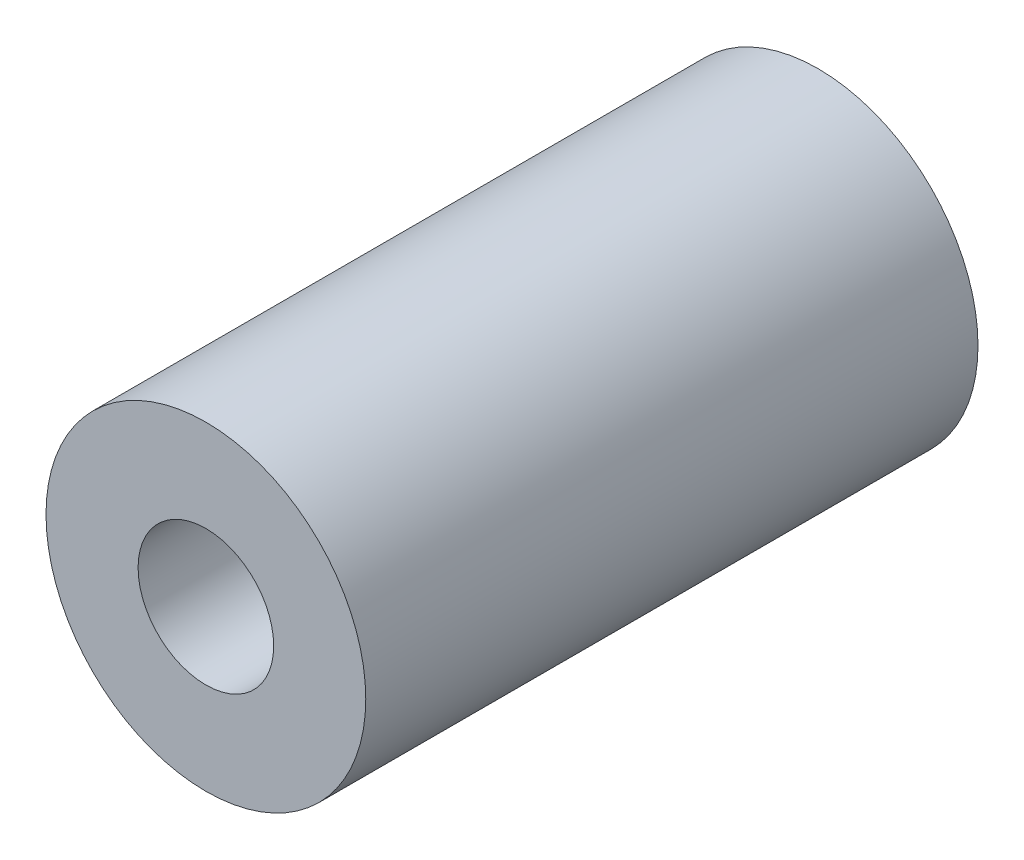
ISO-10303-21;
HEADER;
FILE_DESCRIPTION(('STEP AP214'),'2;1');
FILE_NAME('part.step','',(''),(''),'','','');
FILE_SCHEMA(('AUTOMOTIVE_DESIGN { 1 0 10303 214 1 1 1 1 }'));
ENDSEC;
DATA;
#1=APPLICATION_CONTEXT('core data for automotive mechanical design processes');
#2=APPLICATION_PROTOCOL_DEFINITION('international standard','automotive_design',2000,#1);
#3=PRODUCT_CONTEXT('',#1,'mechanical');
#4=PRODUCT('Part','Part','',(#3));
#5=PRODUCT_RELATED_PRODUCT_CATEGORY('part','',(#4));
#6=PRODUCT_DEFINITION_FORMATION('','',#4);
#7=PRODUCT_DEFINITION_CONTEXT('part definition',#1,'design');
#8=PRODUCT_DEFINITION('design','',#6,#7);
#9=PRODUCT_DEFINITION_SHAPE('','',#8);
#10=(LENGTH_UNIT() NAMED_UNIT(*) SI_UNIT(.MILLI.,.METRE.));
#11=(NAMED_UNIT(*) PLANE_ANGLE_UNIT() SI_UNIT($,.RADIAN.));
#12=(NAMED_UNIT(*) SI_UNIT($,.STERADIAN.) SOLID_ANGLE_UNIT());
#13=UNCERTAINTY_MEASURE_WITH_UNIT(LENGTH_MEASURE(1.E-05),#10,'distance_accuracy_value','');
#14=(GEOMETRIC_REPRESENTATION_CONTEXT(3) GLOBAL_UNCERTAINTY_ASSIGNED_CONTEXT((#13)) GLOBAL_UNIT_ASSIGNED_CONTEXT((#10,
#11,#12)) REPRESENTATION_CONTEXT('',''));
#15=CARTESIAN_POINT('',(0.,0.,0.));
#16=DIRECTION('',(0.,0.,1.));
#17=DIRECTION('',(1.,0.,0.));
#18=AXIS2_PLACEMENT_3D('',#15,#16,#17);
#19=CARTESIAN_POINT('',(0.,0.,9.1186));
#20=DIRECTION('',(0.,0.,-1.));
#21=DIRECTION('',(-1.,0.,0.));
#22=AXIS2_PLACEMENT_3D('',#19,#20,#21);
#23=CYLINDRICAL_SURFACE('',#22,4.7625);
#24=CARTESIAN_POINT('',(0.,0.,9.1186));
#25=DIRECTION('',(0.,0.,1.));
#26=DIRECTION('',(1.,0.,0.));
#27=AXIS2_PLACEMENT_3D('',#24,#25,#26);
#28=CIRCLE('',#27,4.7625);
#29=CARTESIAN_POINT('',(-4.7625,0.,9.1186));
#30=VERTEX_POINT('',#29);
#31=EDGE_CURVE('E10',#30,#30,#28,.T.);
#32=CARTESIAN_POINT('',(0.,0.,-9.1186));
#33=DIRECTION('',(0.,0.,1.));
#34=DIRECTION('',(1.,0.,0.));
#35=AXIS2_PLACEMENT_3D('',#32,#33,#34);
#36=CIRCLE('',#35,4.7625);
#37=CARTESIAN_POINT('',(-4.7625,0.,-9.1186));
#38=VERTEX_POINT('',#37);
#39=EDGE_CURVE('E43',#38,#38,#36,.T.);
#40=CARTESIAN_POINT('',(-4.7625,0.,9.1186));
#41=CARTESIAN_POINT('',(-4.7625,0.,8.92862916666667));
#42=CARTESIAN_POINT('',(-4.7625,0.,8.73865833333333));
#43=CARTESIAN_POINT('',(-4.7625,0.,8.35871666666666));
#44=CARTESIAN_POINT('',(-4.7625,0.,8.16874583333333));
#45=CARTESIAN_POINT('',(-4.7625,0.,7.78880416666667));
#46=CARTESIAN_POINT('',(-4.7625,0.,7.59883333333333));
#47=CARTESIAN_POINT('',(-4.7625,0.,7.21889166666667));
#48=CARTESIAN_POINT('',(-4.7625,0.,7.02892083333333));
#49=CARTESIAN_POINT('',(-4.7625,0.,6.64897916666667));
#50=CARTESIAN_POINT('',(-4.7625,0.,6.45900833333333));
#51=CARTESIAN_POINT('',(-4.7625,0.,6.07906666666667));
#52=CARTESIAN_POINT('',(-4.7625,0.,5.88909583333333));
#53=CARTESIAN_POINT('',(-4.7625,0.,5.50915416666667));
#54=CARTESIAN_POINT('',(-4.7625,0.,5.31918333333333));
#55=CARTESIAN_POINT('',(-4.7625,0.,4.93924166666667));
#56=CARTESIAN_POINT('',(-4.7625,0.,4.74927083333333));
#57=CARTESIAN_POINT('',(-4.7625,0.,4.36932916666667));
#58=CARTESIAN_POINT('',(-4.7625,0.,4.17935833333333));
#59=CARTESIAN_POINT('',(-4.7625,0.,3.79941666666666));
#60=CARTESIAN_POINT('',(-4.7625,0.,3.60944583333333));
#61=CARTESIAN_POINT('',(-4.7625,0.,3.22950416666667));
#62=CARTESIAN_POINT('',(-4.7625,0.,3.03953333333333));
#63=CARTESIAN_POINT('',(-4.7625,0.,2.65959166666667));
#64=CARTESIAN_POINT('',(-4.7625,0.,2.46962083333333));
#65=CARTESIAN_POINT('',(-4.7625,0.,2.08967916666666));
#66=CARTESIAN_POINT('',(-4.7625,0.,1.89970833333333));
#67=CARTESIAN_POINT('',(-4.7625,0.,1.51976666666667));
#68=CARTESIAN_POINT('',(-4.7625,0.,1.32979583333333));
#69=CARTESIAN_POINT('',(-4.7625,0.,0.949854166666667));
#70=CARTESIAN_POINT('',(-4.7625,0.,0.759883333333334));
#71=CARTESIAN_POINT('',(-4.7625,0.,0.379941666666667));
#72=CARTESIAN_POINT('',(-4.7625,0.,0.189970833333333));
#73=CARTESIAN_POINT('',(-4.7625,0.,-0.189970833333333));
#74=CARTESIAN_POINT('',(-4.7625,0.,-0.379941666666667));
#75=CARTESIAN_POINT('',(-4.7625,0.,-0.759883333333334));
#76=CARTESIAN_POINT('',(-4.7625,0.,-0.949854166666667));
#77=CARTESIAN_POINT('',(-4.7625,0.,-1.32979583333333));
#78=CARTESIAN_POINT('',(-4.7625,0.,-1.51976666666667));
#79=CARTESIAN_POINT('',(-4.7625,0.,-1.89970833333333));
#80=CARTESIAN_POINT('',(-4.7625,0.,-2.08967916666667));
#81=CARTESIAN_POINT('',(-4.7625,0.,-2.46962083333333));
#82=CARTESIAN_POINT('',(-4.7625,0.,-2.65959166666667));
#83=CARTESIAN_POINT('',(-4.7625,0.,-3.03953333333333));
#84=CARTESIAN_POINT('',(-4.7625,0.,-3.22950416666667));
#85=CARTESIAN_POINT('',(-4.7625,0.,-3.60944583333333));
#86=CARTESIAN_POINT('',(-4.7625,0.,-3.79941666666667));
#87=CARTESIAN_POINT('',(-4.7625,0.,-4.17935833333333));
#88=CARTESIAN_POINT('',(-4.7625,0.,-4.36932916666667));
#89=CARTESIAN_POINT('',(-4.7625,0.,-4.74927083333333));
#90=CARTESIAN_POINT('',(-4.7625,0.,-4.93924166666667));
#91=CARTESIAN_POINT('',(-4.7625,0.,-5.31918333333333));
#92=CARTESIAN_POINT('',(-4.7625,0.,-5.50915416666667));
#93=CARTESIAN_POINT('',(-4.7625,0.,-5.88909583333333));
#94=CARTESIAN_POINT('',(-4.7625,0.,-6.07906666666667));
#95=CARTESIAN_POINT('',(-4.7625,0.,-6.45900833333333));
#96=CARTESIAN_POINT('',(-4.7625,0.,-6.64897916666667));
#97=CARTESIAN_POINT('',(-4.7625,0.,-7.02892083333333));
#98=CARTESIAN_POINT('',(-4.7625,0.,-7.21889166666667));
#99=CARTESIAN_POINT('',(-4.7625,0.,-7.59883333333333));
#100=CARTESIAN_POINT('',(-4.7625,0.,-7.78880416666667));
#101=CARTESIAN_POINT('',(-4.7625,0.,-8.16874583333333));
#102=CARTESIAN_POINT('',(-4.7625,0.,-8.35871666666667));
#103=CARTESIAN_POINT('',(-4.7625,0.,-8.73865833333333));
#104=CARTESIAN_POINT('',(-4.7625,0.,-8.92862916666667));
#105=CARTESIAN_POINT('',(-4.7625,0.,-9.1186));
#106=B_SPLINE_CURVE_WITH_KNOTS('',3,(#40,#41,#42,#43,#44,#45,#46,#47,#48,#49,#50,#51,#52,#53,
#54,#55,#56,#57,#58,#59,#60,#61,#62,#63,#64,#65,#66,#67,#68,#69,#70,#71,#72,#73,#74,#75,#76,#77,
#78,#79,#80,#81,#82,#83,#84,#85,#86,#87,#88,#89,#90,#91,#92,#93,#94,#95,#96,#97,#98,#99,#100,
#101,#102,#103,#104,#105),.UNSPECIFIED.,.F.,.F.,(4,2,2,2,2,2,2,2,2,2,2,2,2,2,2,2,2,2,2,2,2,2,2,
2,2,2,2,2,2,2,2,2,4),(0.,0.5699125,1.139825,1.7097375,2.27965,2.8495625,3.419475,3.9893875,
4.5593,5.1292125,5.699125,6.2690375,6.83895,7.4088625,7.978775,8.5486875,9.1186,9.6885125,
10.258425,10.8283375,11.39825,11.9681625,12.538075,13.1079875,13.6779,14.2478125,14.817725,
15.3876375,15.95755,16.5274625,17.097375,17.6672875,18.2372),.UNSPECIFIED.);
#107=EDGE_CURVE('BSEAM40',#30,#38,#106,.T.);
#108=ORIENTED_EDGE('',*,*,#31,.F.);
#109=ORIENTED_EDGE('',*,*,#39,.T.);
#110=ORIENTED_EDGE('',*,*,#107,.T.);
#111=ORIENTED_EDGE('',*,*,#107,.F.);
#112=EDGE_LOOP('',(#108,#110,#109,#111));
#113=FACE_BOUND('',#112,.T.);
#114=ADVANCED_FACE('F40',(#113),#23,.T.);
#115=CARTESIAN_POINT('',(0.,0.,9.1186));
#116=DIRECTION('',(0.,0.,1.));
#117=DIRECTION('',(1.,0.,0.));
#118=AXIS2_PLACEMENT_3D('',#115,#116,#117);
#119=PLANE('',#118);
#120=CARTESIAN_POINT('',(0.,0.,9.1186));
#121=DIRECTION('',(0.,0.,1.));
#122=DIRECTION('',(1.,0.,0.));
#123=AXIS2_PLACEMENT_3D('',#120,#121,#122);
#124=CIRCLE('',#123,2.01929999999999);
#125=CARTESIAN_POINT('',(2.01929999999999,0.,9.1186));
#126=VERTEX_POINT('',#125);
#127=EDGE_CURVE('E54',#126,#126,#124,.T.);
#128=ORIENTED_EDGE('',*,*,#127,.F.);
#129=EDGE_LOOP('',(#128));
#130=FACE_BOUND('',#129,.T.);
#131=ORIENTED_EDGE('',*,*,#31,.T.);
#132=EDGE_LOOP('',(#131));
#133=FACE_BOUND('',#132,.T.);
#134=ADVANCED_FACE('F60',(#130,#133),#119,.T.);
#135=CARTESIAN_POINT('',(0.,0.,-9.1186));
#136=DIRECTION('',(0.,0.,1.));
#137=DIRECTION('',(1.,0.,0.));
#138=AXIS2_PLACEMENT_3D('',#135,#136,#137);
#139=PLANE('',#138);
#140=CARTESIAN_POINT('',(0.,0.,-9.1186));
#141=DIRECTION('',(0.,0.,-1.));
#142=DIRECTION('',(-1.,0.,0.));
#143=AXIS2_PLACEMENT_3D('',#140,#141,#142);
#144=CIRCLE('',#143,2.01929999999999);
#145=CARTESIAN_POINT('',(-2.01929999999999,0.,-9.1186));
#146=VERTEX_POINT('',#145);
#147=EDGE_CURVE('E50',#146,#146,#144,.T.);
#148=ORIENTED_EDGE('',*,*,#147,.F.);
#149=EDGE_LOOP('',(#148));
#150=FACE_BOUND('',#149,.T.);
#151=ORIENTED_EDGE('',*,*,#39,.F.);
#152=EDGE_LOOP('',(#151));
#153=FACE_BOUND('',#152,.T.);
#154=ADVANCED_FACE('F62',(#150,#153),#139,.F.);
#155=CARTESIAN_POINT('',(0.,0.,-9.1186));
#156=DIRECTION('',(0.,0.,-1.));
#157=DIRECTION('',(-1.,0.,0.));
#158=AXIS2_PLACEMENT_3D('',#155,#156,#157);
#159=CYLINDRICAL_SURFACE('',#158,2.01929999999999);
#160=ORIENTED_EDGE('',*,*,#147,.T.);
#161=EDGE_LOOP('',(#160));
#162=FACE_BOUND('',#161,.T.);
#163=ORIENTED_EDGE('',*,*,#127,.T.);
#164=EDGE_LOOP('',(#163));
#165=FACE_BOUND('',#164,.T.);
#166=ADVANCED_FACE('F58',(#162,#165),#159,.F.);
#167=CLOSED_SHELL('',(#114,#134,#154,#166));
#168=MANIFOLD_SOLID_BREP('B2',#167);
#169=ADVANCED_BREP_SHAPE_REPRESENTATION('',(#18,#168),#14);
#170=SHAPE_DEFINITION_REPRESENTATION(#9,#169);
ENDSEC;
END-ISO-10303-21;
